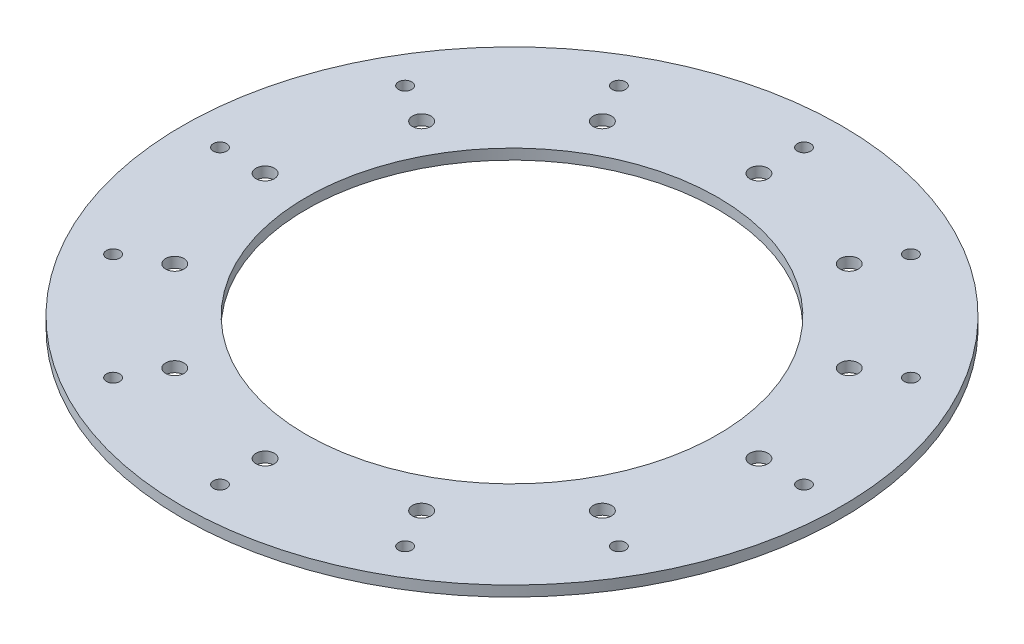
ISO-10303-21;
HEADER;
FILE_DESCRIPTION(('STEP AP214'),'2;1');
FILE_NAME('part.step','',(''),(''),'','','');
FILE_SCHEMA(('AUTOMOTIVE_DESIGN { 1 0 10303 214 1 1 1 1 }'));
ENDSEC;
DATA;
#1=APPLICATION_CONTEXT('core data for automotive mechanical design processes');
#2=APPLICATION_PROTOCOL_DEFINITION('international standard','automotive_design',2000,#1);
#3=PRODUCT_CONTEXT('',#1,'mechanical');
#4=PRODUCT('Part','Part','',(#3));
#5=PRODUCT_RELATED_PRODUCT_CATEGORY('part','',(#4));
#6=PRODUCT_DEFINITION_FORMATION('','',#4);
#7=PRODUCT_DEFINITION_CONTEXT('part definition',#1,'design');
#8=PRODUCT_DEFINITION('design','',#6,#7);
#9=PRODUCT_DEFINITION_SHAPE('','',#8);
#10=(LENGTH_UNIT() NAMED_UNIT(*) SI_UNIT(.MILLI.,.METRE.));
#11=(NAMED_UNIT(*) PLANE_ANGLE_UNIT() SI_UNIT($,.RADIAN.));
#12=(NAMED_UNIT(*) SI_UNIT($,.STERADIAN.) SOLID_ANGLE_UNIT());
#13=UNCERTAINTY_MEASURE_WITH_UNIT(LENGTH_MEASURE(1.E-05),#10,'distance_accuracy_value','');
#14=(GEOMETRIC_REPRESENTATION_CONTEXT(3) GLOBAL_UNCERTAINTY_ASSIGNED_CONTEXT((#13)) GLOBAL_UNIT_ASSIGNED_CONTEXT((#10,
#11,#12)) REPRESENTATION_CONTEXT('',''));
#15=CARTESIAN_POINT('',(0.,0.,0.));
#16=DIRECTION('',(0.,0.,1.));
#17=DIRECTION('',(1.,0.,0.));
#18=AXIS2_PLACEMENT_3D('',#15,#16,#17);
#19=CARTESIAN_POINT('',(0.,2.5,0.));
#20=DIRECTION('',(0.,1.,0.));
#21=DIRECTION('',(0.,0.,1.));
#22=AXIS2_PLACEMENT_3D('',#19,#20,#21);
#23=PLANE('',#22);
#24=CARTESIAN_POINT('',(29.5899999999978,2.5,-51.2513833959643));
#25=DIRECTION('',(0.,1.,0.));
#26=DIRECTION('',(0.,0.,1.));
#27=AXIS2_PLACEMENT_3D('',#24,#25,#26);
#28=CIRCLE('',#27,2.19999999999999);
#29=CARTESIAN_POINT('',(29.5899999999978,2.5,-49.0513833959643));
#30=VERTEX_POINT('',#29);
#31=EDGE_CURVE('E189',#30,#30,#28,.T.);
#32=ORIENTED_EDGE('',*,*,#31,.F.);
#33=EDGE_LOOP('',(#32));
#34=FACE_BOUND('',#33,.T.);
#35=CARTESIAN_POINT('',(51.2513833959618,2.5,-29.5900000000022));
#36=DIRECTION('',(0.,1.,0.));
#37=DIRECTION('',(0.,0.,1.));
#38=AXIS2_PLACEMENT_3D('',#35,#36,#37);
#39=CIRCLE('',#38,2.20000000000001);
#40=CARTESIAN_POINT('',(51.2513833959618,2.5,-27.3900000000022));
#41=VERTEX_POINT('',#40);
#42=EDGE_CURVE('E183',#41,#41,#39,.T.);
#43=ORIENTED_EDGE('',*,*,#42,.F.);
#44=EDGE_LOOP('',(#43));
#45=FACE_BOUND('',#44,.T.);
#46=CARTESIAN_POINT('',(59.18,2.5,-2.51925216798732E-12));
#47=DIRECTION('',(0.,1.,0.));
#48=DIRECTION('',(0.,0.,1.));
#49=AXIS2_PLACEMENT_3D('',#46,#47,#48);
#50=CIRCLE('',#49,2.2);
#51=CARTESIAN_POINT('',(59.18,2.5,2.19999999999748));
#52=VERTEX_POINT('',#51);
#53=EDGE_CURVE('E177',#52,#52,#50,.T.);
#54=ORIENTED_EDGE('',*,*,#53,.F.);
#55=EDGE_LOOP('',(#54));
#56=FACE_BOUND('',#55,.T.);
#57=CARTESIAN_POINT('',(51.2513833959643,2.5,29.5899999999978));
#58=DIRECTION('',(0.,1.,0.));
#59=DIRECTION('',(0.,0.,1.));
#60=AXIS2_PLACEMENT_3D('',#57,#58,#59);
#61=CIRCLE('',#60,2.2);
#62=CARTESIAN_POINT('',(51.2513833959643,2.5,31.7899999999978));
#63=VERTEX_POINT('',#62);
#64=EDGE_CURVE('E171',#63,#63,#61,.T.);
#65=ORIENTED_EDGE('',*,*,#64,.F.);
#66=EDGE_LOOP('',(#65));
#67=FACE_BOUND('',#66,.T.);
#68=CARTESIAN_POINT('',(29.5900000000022,2.5,51.2513833959618));
#69=DIRECTION('',(0.,1.,0.));
#70=DIRECTION('',(0.,0.,1.));
#71=AXIS2_PLACEMENT_3D('',#68,#69,#70);
#72=CIRCLE('',#71,2.2);
#73=CARTESIAN_POINT('',(29.5900000000022,2.5,53.4513833959618));
#74=VERTEX_POINT('',#73);
#75=EDGE_CURVE('E165',#74,#74,#72,.T.);
#76=ORIENTED_EDGE('',*,*,#75,.F.);
#77=EDGE_LOOP('',(#76));
#78=FACE_BOUND('',#77,.T.);
#79=CARTESIAN_POINT('',(2.5157214821059E-12,2.5,59.18));
#80=DIRECTION('',(0.,1.,0.));
#81=DIRECTION('',(0.,0.,1.));
#82=AXIS2_PLACEMENT_3D('',#79,#80,#81);
#83=CIRCLE('',#82,2.2);
#84=CARTESIAN_POINT('',(2.5157214821059E-12,2.5,61.38));
#85=VERTEX_POINT('',#84);
#86=EDGE_CURVE('E159',#85,#85,#83,.T.);
#87=ORIENTED_EDGE('',*,*,#86,.F.);
#88=EDGE_LOOP('',(#87));
#89=FACE_BOUND('',#88,.T.);
#90=CARTESIAN_POINT('',(-29.5899999999978,2.5,51.2513833959643));
#91=DIRECTION('',(0.,1.,0.));
#92=DIRECTION('',(0.,0.,1.));
#93=AXIS2_PLACEMENT_3D('',#90,#91,#92);
#94=CIRCLE('',#93,2.2);
#95=CARTESIAN_POINT('',(-29.5899999999978,2.5,53.4513833959643));
#96=VERTEX_POINT('',#95);
#97=EDGE_CURVE('E153',#96,#96,#94,.T.);
#98=ORIENTED_EDGE('',*,*,#97,.F.);
#99=EDGE_LOOP('',(#98));
#100=FACE_BOUND('',#99,.T.);
#101=CARTESIAN_POINT('',(-51.2513833959618,2.5,29.5900000000022));
#102=DIRECTION('',(0.,1.,0.));
#103=DIRECTION('',(0.,0.,1.));
#104=AXIS2_PLACEMENT_3D('',#101,#102,#103);
#105=CIRCLE('',#104,2.2);
#106=CARTESIAN_POINT('',(-51.2513833959618,2.5,31.7900000000022));
#107=VERTEX_POINT('',#106);
#108=EDGE_CURVE('E147',#107,#107,#105,.T.);
#109=ORIENTED_EDGE('',*,*,#108,.F.);
#110=EDGE_LOOP('',(#109));
#111=FACE_BOUND('',#110,.T.);
#112=CARTESIAN_POINT('',(-59.18,2.5,2.52662474276022E-12));
#113=DIRECTION('',(0.,1.,0.));
#114=DIRECTION('',(0.,0.,1.));
#115=AXIS2_PLACEMENT_3D('',#112,#113,#114);
#116=CIRCLE('',#115,2.2);
#117=CARTESIAN_POINT('',(-59.18,2.5,2.20000000000253));
#118=VERTEX_POINT('',#117);
#119=EDGE_CURVE('E141',#118,#118,#116,.T.);
#120=ORIENTED_EDGE('',*,*,#119,.F.);
#121=EDGE_LOOP('',(#120));
#122=FACE_BOUND('',#121,.T.);
#123=CARTESIAN_POINT('',(-51.2513833959643,2.5,-29.5899999999978));
#124=DIRECTION('',(0.,1.,0.));
#125=DIRECTION('',(0.,0.,1.));
#126=AXIS2_PLACEMENT_3D('',#123,#124,#125);
#127=CIRCLE('',#126,2.2);
#128=CARTESIAN_POINT('',(-51.2513833959643,2.5,-27.3899999999978));
#129=VERTEX_POINT('',#128);
#130=EDGE_CURVE('E135',#129,#129,#127,.T.);
#131=ORIENTED_EDGE('',*,*,#130,.F.);
#132=EDGE_LOOP('',(#131));
#133=FACE_BOUND('',#132,.T.);
#134=CARTESIAN_POINT('',(-29.5900000000022,2.5,-51.2513833959618));
#135=DIRECTION('',(0.,1.,0.));
#136=DIRECTION('',(0.,0.,1.));
#137=AXIS2_PLACEMENT_3D('',#134,#135,#136);
#138=CIRCLE('',#137,2.2);
#139=CARTESIAN_POINT('',(-29.5900000000022,2.5,-49.0513833959618));
#140=VERTEX_POINT('',#139);
#141=EDGE_CURVE('E129',#140,#140,#138,.T.);
#142=ORIENTED_EDGE('',*,*,#141,.F.);
#143=EDGE_LOOP('',(#142));
#144=FACE_BOUND('',#143,.T.);
#145=CARTESIAN_POINT('',(-2.51573553974758E-12,2.5,-59.18));
#146=DIRECTION('',(0.,1.,0.));
#147=DIRECTION('',(0.,0.,1.));
#148=AXIS2_PLACEMENT_3D('',#145,#146,#147);
#149=CIRCLE('',#148,2.2);
#150=CARTESIAN_POINT('',(-2.51573553974758E-12,2.5,-56.98));
#151=VERTEX_POINT('',#150);
#152=EDGE_CURVE('E123',#151,#151,#149,.T.);
#153=ORIENTED_EDGE('',*,*,#152,.F.);
#154=EDGE_LOOP('',(#153));
#155=FACE_BOUND('',#154,.T.);
#156=CARTESIAN_POINT('',(35.0000000000011,2.5,-60.6217782649147));
#157=DIRECTION('',(0.,1.,0.));
#158=DIRECTION('',(0.,0.,1.));
#159=AXIS2_PLACEMENT_3D('',#156,#157,#158);
#160=CIRCLE('',#159,1.59999999999992);
#161=CARTESIAN_POINT('',(35.0000000000011,2.5,-59.0217782649148));
#162=VERTEX_POINT('',#161);
#163=EDGE_CURVE('E118',#162,#162,#160,.T.);
#164=ORIENTED_EDGE('',*,*,#163,.F.);
#165=EDGE_LOOP('',(#164));
#166=FACE_BOUND('',#165,.T.);
#167=CARTESIAN_POINT('',(60.6217782649147,2.5,-35.0000000000069));
#168=DIRECTION('',(0.,1.,0.));
#169=DIRECTION('',(0.,0.,1.));
#170=AXIS2_PLACEMENT_3D('',#167,#168,#169);
#171=CIRCLE('',#170,1.60000000000196);
#172=CARTESIAN_POINT('',(60.6217782649147,2.5,-33.4000000000049));
#173=VERTEX_POINT('',#172);
#174=EDGE_CURVE('E112',#173,#173,#171,.T.);
#175=ORIENTED_EDGE('',*,*,#174,.F.);
#176=EDGE_LOOP('',(#175));
#177=FACE_BOUND('',#176,.T.);
#178=CARTESIAN_POINT('',(70.000000000008,2.5,-7.94950611291909E-12));
#179=DIRECTION('',(0.,1.,0.));
#180=DIRECTION('',(0.,0.,1.));
#181=AXIS2_PLACEMENT_3D('',#178,#179,#180);
#182=CIRCLE('',#181,1.60000000000551);
#183=CARTESIAN_POINT('',(70.000000000008,2.5,1.59999999999756));
#184=VERTEX_POINT('',#183);
#185=EDGE_CURVE('E106',#184,#184,#182,.T.);
#186=ORIENTED_EDGE('',*,*,#185,.F.);
#187=EDGE_LOOP('',(#186));
#188=FACE_BOUND('',#187,.T.);
#189=CARTESIAN_POINT('',(60.6217782649226,2.5,34.9999999999931));
#190=DIRECTION('',(0.,1.,0.));
#191=DIRECTION('',(0.,0.,1.));
#192=AXIS2_PLACEMENT_3D('',#189,#190,#191);
#193=CIRCLE('',#192,1.60000000000973);
#194=CARTESIAN_POINT('',(60.6217782649226,2.5,36.6000000000028));
#195=VERTEX_POINT('',#194);
#196=EDGE_CURVE('E100',#195,#195,#193,.T.);
#197=ORIENTED_EDGE('',*,*,#196,.F.);
#198=EDGE_LOOP('',(#197));
#199=FACE_BOUND('',#198,.T.);
#200=CARTESIAN_POINT('',(35.0000000000149,2.5,60.6217782649067));
#201=DIRECTION('',(0.,1.,0.));
#202=DIRECTION('',(0.,0.,1.));
#203=AXIS2_PLACEMENT_3D('',#200,#201,#202);
#204=CIRCLE('',#203,1.60000000001344);
#205=CARTESIAN_POINT('',(35.0000000000149,2.5,62.2217782649202));
#206=VERTEX_POINT('',#205);
#207=EDGE_CURVE('E94',#206,#206,#204,.T.);
#208=ORIENTED_EDGE('',*,*,#207,.F.);
#209=EDGE_LOOP('',(#208));
#210=FACE_BOUND('',#209,.T.);
#211=CARTESIAN_POINT('',(1.58990122258382E-11,2.5,70.));
#212=DIRECTION('',(0.,1.,0.));
#213=DIRECTION('',(0.,0.,1.));
#214=AXIS2_PLACEMENT_3D('',#211,#212,#213);
#215=CIRCLE('',#214,1.60000000001567);
#216=CARTESIAN_POINT('',(1.58990122258382E-11,2.5,71.6000000000157));
#217=VERTEX_POINT('',#216);
#218=EDGE_CURVE('E88',#217,#217,#215,.T.);
#219=ORIENTED_EDGE('',*,*,#218,.F.);
#220=EDGE_LOOP('',(#219));
#221=FACE_BOUND('',#220,.T.);
#222=CARTESIAN_POINT('',(-34.9999999999852,2.5,60.6217782649147));
#223=DIRECTION('',(0.,1.,0.));
#224=DIRECTION('',(0.,0.,1.));
#225=AXIS2_PLACEMENT_3D('',#222,#223,#224);
#226=CIRCLE('',#225,1.6000000000159);
#227=CARTESIAN_POINT('',(-34.9999999999852,2.5,62.2217782649306));
#228=VERTEX_POINT('',#227);
#229=EDGE_CURVE('E82',#228,#228,#226,.T.);
#230=ORIENTED_EDGE('',*,*,#229,.F.);
#231=EDGE_LOOP('',(#230));
#232=FACE_BOUND('',#231,.T.);
#233=CARTESIAN_POINT('',(-60.6217782648988,2.5,35.0000000000069));
#234=DIRECTION('',(0.,1.,0.));
#235=DIRECTION('',(0.,0.,1.));
#236=AXIS2_PLACEMENT_3D('',#233,#234,#235);
#237=CIRCLE('',#236,1.60000000001406);
#238=CARTESIAN_POINT('',(-60.6217782648988,2.5,36.600000000021));
#239=VERTEX_POINT('',#238);
#240=EDGE_CURVE('E76',#239,#239,#237,.T.);
#241=ORIENTED_EDGE('',*,*,#240,.F.);
#242=EDGE_LOOP('',(#241));
#243=FACE_BOUND('',#242,.T.);
#244=CARTESIAN_POINT('',(-69.9999999999921,2.5,7.95807864051312E-12));
#245=DIRECTION('',(0.,1.,0.));
#246=DIRECTION('',(0.,0.,1.));
#247=AXIS2_PLACEMENT_3D('',#244,#245,#246);
#248=CIRCLE('',#247,1.60000000001064);
#249=CARTESIAN_POINT('',(-69.9999999999921,2.5,1.6000000000186));
#250=VERTEX_POINT('',#249);
#251=EDGE_CURVE('E70',#250,#250,#248,.T.);
#252=ORIENTED_EDGE('',*,*,#251,.F.);
#253=EDGE_LOOP('',(#252));
#254=FACE_BOUND('',#253,.T.);
#255=CARTESIAN_POINT('',(-60.6217782649068,2.5,-34.9999999999931));
#256=DIRECTION('',(0.,1.,0.));
#257=DIRECTION('',(0.,0.,1.));
#258=AXIS2_PLACEMENT_3D('',#255,#256,#257);
#259=CIRCLE('',#258,1.60000000000665);
#260=CARTESIAN_POINT('',(-60.6217782649068,2.5,-33.3999999999864));
#261=VERTEX_POINT('',#260);
#262=EDGE_CURVE('E64',#261,#261,#259,.T.);
#263=ORIENTED_EDGE('',*,*,#262,.F.);
#264=EDGE_LOOP('',(#263));
#265=FACE_BOUND('',#264,.T.);
#266=CARTESIAN_POINT('',(-34.999999999999,2.5,-60.6217782649067));
#267=DIRECTION('',(0.,1.,0.));
#268=DIRECTION('',(0.,0.,1.));
#269=AXIS2_PLACEMENT_3D('',#266,#267,#268);
#270=CIRCLE('',#269,1.60000000000308);
#271=CARTESIAN_POINT('',(-34.999999999999,2.5,-59.0217782649036));
#272=VERTEX_POINT('',#271);
#273=EDGE_CURVE('E57',#272,#272,#270,.T.);
#274=ORIENTED_EDGE('',*,*,#273,.F.);
#275=EDGE_LOOP('',(#274));
#276=FACE_BOUND('',#275,.T.);
#277=CARTESIAN_POINT('',(0.,2.5,-70.));
#278=DIRECTION('',(0.,1.,0.));
#279=DIRECTION('',(0.,0.,1.));
#280=AXIS2_PLACEMENT_3D('',#277,#278,#279);
#281=CIRCLE('',#280,1.6);
#282=CARTESIAN_POINT('',(0.,2.5,-68.4));
#283=VERTEX_POINT('',#282);
#284=EDGE_CURVE('E51',#283,#283,#281,.T.);
#285=ORIENTED_EDGE('',*,*,#284,.F.);
#286=EDGE_LOOP('',(#285));
#287=FACE_BOUND('',#286,.T.);
#288=CARTESIAN_POINT('',(0.,2.5,0.));
#289=DIRECTION('',(0.,1.,0.));
#290=DIRECTION('',(0.,0.,1.));
#291=AXIS2_PLACEMENT_3D('',#288,#289,#290);
#292=CIRCLE('',#291,79.);
#293=CARTESIAN_POINT('',(0.,2.5,79.));
#294=VERTEX_POINT('',#293);
#295=EDGE_CURVE('E10',#294,#294,#292,.T.);
#296=ORIENTED_EDGE('',*,*,#295,.T.);
#297=EDGE_LOOP('',(#296));
#298=FACE_BOUND('',#297,.T.);
#299=CARTESIAN_POINT('',(0.,2.5,0.));
#300=DIRECTION('',(0.,1.,0.));
#301=DIRECTION('',(0.,0.,1.));
#302=AXIS2_PLACEMENT_3D('',#299,#300,#301);
#303=CIRCLE('',#302,49.3);
#304=CARTESIAN_POINT('',(0.,2.5,49.3));
#305=VERTEX_POINT('',#304);
#306=EDGE_CURVE('E43',#305,#305,#303,.T.);
#307=ORIENTED_EDGE('',*,*,#306,.F.);
#308=EDGE_LOOP('',(#307));
#309=FACE_BOUND('',#308,.T.);
#310=ADVANCED_FACE('F32',(#34,#45,#56,#67,#78,#89,#100,#111,#122,#133,#144,#155,#166,#177,#188,
#199,#210,#221,#232,#243,#254,#265,#276,#287,#298,#309),#23,.T.);
#311=CARTESIAN_POINT('',(0.,0.,0.));
#312=DIRECTION('',(0.,1.,0.));
#313=DIRECTION('',(0.,0.,1.));
#314=AXIS2_PLACEMENT_3D('',#311,#312,#313);
#315=PLANE('',#314);
#316=CARTESIAN_POINT('',(29.5899999999978,0.,-51.2513833959643));
#317=DIRECTION('',(0.,1.,0.));
#318=DIRECTION('',(0.,0.,1.));
#319=AXIS2_PLACEMENT_3D('',#316,#317,#318);
#320=CIRCLE('',#319,2.19999999999999);
#321=CARTESIAN_POINT('',(29.5899999999978,0.,-49.0513833959643));
#322=VERTEX_POINT('',#321);
#323=EDGE_CURVE('E126',#322,#322,#320,.T.);
#324=ORIENTED_EDGE('',*,*,#323,.T.);
#325=EDGE_LOOP('',(#324));
#326=FACE_BOUND('',#325,.T.);
#327=CARTESIAN_POINT('',(51.2513833959618,0.,-29.5900000000022));
#328=DIRECTION('',(0.,1.,0.));
#329=DIRECTION('',(0.,0.,1.));
#330=AXIS2_PLACEMENT_3D('',#327,#328,#329);
#331=CIRCLE('',#330,2.20000000000001);
#332=CARTESIAN_POINT('',(51.2513833959618,0.,-27.3900000000022));
#333=VERTEX_POINT('',#332);
#334=EDGE_CURVE('E186',#333,#333,#331,.T.);
#335=ORIENTED_EDGE('',*,*,#334,.T.);
#336=EDGE_LOOP('',(#335));
#337=FACE_BOUND('',#336,.T.);
#338=CARTESIAN_POINT('',(59.18,0.,-2.51925216798732E-12));
#339=DIRECTION('',(0.,1.,0.));
#340=DIRECTION('',(0.,0.,1.));
#341=AXIS2_PLACEMENT_3D('',#338,#339,#340);
#342=CIRCLE('',#341,2.2);
#343=CARTESIAN_POINT('',(59.18,0.,2.19999999999748));
#344=VERTEX_POINT('',#343);
#345=EDGE_CURVE('E180',#344,#344,#342,.T.);
#346=ORIENTED_EDGE('',*,*,#345,.T.);
#347=EDGE_LOOP('',(#346));
#348=FACE_BOUND('',#347,.T.);
#349=CARTESIAN_POINT('',(51.2513833959643,0.,29.5899999999978));
#350=DIRECTION('',(0.,1.,0.));
#351=DIRECTION('',(0.,0.,1.));
#352=AXIS2_PLACEMENT_3D('',#349,#350,#351);
#353=CIRCLE('',#352,2.2);
#354=CARTESIAN_POINT('',(51.2513833959643,0.,31.7899999999978));
#355=VERTEX_POINT('',#354);
#356=EDGE_CURVE('E174',#355,#355,#353,.T.);
#357=ORIENTED_EDGE('',*,*,#356,.T.);
#358=EDGE_LOOP('',(#357));
#359=FACE_BOUND('',#358,.T.);
#360=CARTESIAN_POINT('',(29.5900000000022,0.,51.2513833959618));
#361=DIRECTION('',(0.,1.,0.));
#362=DIRECTION('',(0.,0.,1.));
#363=AXIS2_PLACEMENT_3D('',#360,#361,#362);
#364=CIRCLE('',#363,2.2);
#365=CARTESIAN_POINT('',(29.5900000000022,0.,53.4513833959618));
#366=VERTEX_POINT('',#365);
#367=EDGE_CURVE('E168',#366,#366,#364,.T.);
#368=ORIENTED_EDGE('',*,*,#367,.T.);
#369=EDGE_LOOP('',(#368));
#370=FACE_BOUND('',#369,.T.);
#371=CARTESIAN_POINT('',(2.5157214821059E-12,0.,59.18));
#372=DIRECTION('',(0.,1.,0.));
#373=DIRECTION('',(0.,0.,1.));
#374=AXIS2_PLACEMENT_3D('',#371,#372,#373);
#375=CIRCLE('',#374,2.2);
#376=CARTESIAN_POINT('',(2.5157214821059E-12,0.,61.38));
#377=VERTEX_POINT('',#376);
#378=EDGE_CURVE('E162',#377,#377,#375,.T.);
#379=ORIENTED_EDGE('',*,*,#378,.T.);
#380=EDGE_LOOP('',(#379));
#381=FACE_BOUND('',#380,.T.);
#382=CARTESIAN_POINT('',(-29.5899999999978,0.,51.2513833959643));
#383=DIRECTION('',(0.,1.,0.));
#384=DIRECTION('',(0.,0.,1.));
#385=AXIS2_PLACEMENT_3D('',#382,#383,#384);
#386=CIRCLE('',#385,2.2);
#387=CARTESIAN_POINT('',(-29.5899999999978,0.,53.4513833959643));
#388=VERTEX_POINT('',#387);
#389=EDGE_CURVE('E156',#388,#388,#386,.T.);
#390=ORIENTED_EDGE('',*,*,#389,.T.);
#391=EDGE_LOOP('',(#390));
#392=FACE_BOUND('',#391,.T.);
#393=CARTESIAN_POINT('',(-51.2513833959618,0.,29.5900000000022));
#394=DIRECTION('',(0.,1.,0.));
#395=DIRECTION('',(0.,0.,1.));
#396=AXIS2_PLACEMENT_3D('',#393,#394,#395);
#397=CIRCLE('',#396,2.2);
#398=CARTESIAN_POINT('',(-51.2513833959618,0.,31.7900000000022));
#399=VERTEX_POINT('',#398);
#400=EDGE_CURVE('E150',#399,#399,#397,.T.);
#401=ORIENTED_EDGE('',*,*,#400,.T.);
#402=EDGE_LOOP('',(#401));
#403=FACE_BOUND('',#402,.T.);
#404=CARTESIAN_POINT('',(-59.18,0.,2.52662474276022E-12));
#405=DIRECTION('',(0.,1.,0.));
#406=DIRECTION('',(0.,0.,1.));
#407=AXIS2_PLACEMENT_3D('',#404,#405,#406);
#408=CIRCLE('',#407,2.2);
#409=CARTESIAN_POINT('',(-59.18,0.,2.20000000000253));
#410=VERTEX_POINT('',#409);
#411=EDGE_CURVE('E144',#410,#410,#408,.T.);
#412=ORIENTED_EDGE('',*,*,#411,.T.);
#413=EDGE_LOOP('',(#412));
#414=FACE_BOUND('',#413,.T.);
#415=CARTESIAN_POINT('',(-51.2513833959643,0.,-29.5899999999978));
#416=DIRECTION('',(0.,1.,0.));
#417=DIRECTION('',(0.,0.,1.));
#418=AXIS2_PLACEMENT_3D('',#415,#416,#417);
#419=CIRCLE('',#418,2.2);
#420=CARTESIAN_POINT('',(-51.2513833959643,0.,-27.3899999999978));
#421=VERTEX_POINT('',#420);
#422=EDGE_CURVE('E138',#421,#421,#419,.T.);
#423=ORIENTED_EDGE('',*,*,#422,.T.);
#424=EDGE_LOOP('',(#423));
#425=FACE_BOUND('',#424,.T.);
#426=CARTESIAN_POINT('',(-29.5900000000022,0.,-51.2513833959618));
#427=DIRECTION('',(0.,1.,0.));
#428=DIRECTION('',(0.,0.,1.));
#429=AXIS2_PLACEMENT_3D('',#426,#427,#428);
#430=CIRCLE('',#429,2.2);
#431=CARTESIAN_POINT('',(-29.5900000000022,0.,-49.0513833959618));
#432=VERTEX_POINT('',#431);
#433=EDGE_CURVE('E132',#432,#432,#430,.T.);
#434=ORIENTED_EDGE('',*,*,#433,.T.);
#435=EDGE_LOOP('',(#434));
#436=FACE_BOUND('',#435,.T.);
#437=CARTESIAN_POINT('',(-2.51573553974758E-12,0.,-59.18));
#438=DIRECTION('',(0.,1.,0.));
#439=DIRECTION('',(0.,0.,1.));
#440=AXIS2_PLACEMENT_3D('',#437,#438,#439);
#441=CIRCLE('',#440,2.2);
#442=CARTESIAN_POINT('',(-2.51573553974758E-12,0.,-56.98));
#443=VERTEX_POINT('',#442);
#444=EDGE_CURVE('E61',#443,#443,#441,.T.);
#445=ORIENTED_EDGE('',*,*,#444,.T.);
#446=EDGE_LOOP('',(#445));
#447=FACE_BOUND('',#446,.T.);
#448=CARTESIAN_POINT('',(35.0000000000011,0.,-60.6217782649147));
#449=DIRECTION('',(0.,1.,0.));
#450=DIRECTION('',(0.,0.,1.));
#451=AXIS2_PLACEMENT_3D('',#448,#449,#450);
#452=CIRCLE('',#451,1.59999999999992);
#453=CARTESIAN_POINT('',(35.0000000000011,0.,-59.0217782649148));
#454=VERTEX_POINT('',#453);
#455=EDGE_CURVE('E54',#454,#454,#452,.T.);
#456=ORIENTED_EDGE('',*,*,#455,.T.);
#457=EDGE_LOOP('',(#456));
#458=FACE_BOUND('',#457,.T.);
#459=CARTESIAN_POINT('',(60.6217782649147,0.,-35.0000000000069));
#460=DIRECTION('',(0.,1.,0.));
#461=DIRECTION('',(0.,0.,1.));
#462=AXIS2_PLACEMENT_3D('',#459,#460,#461);
#463=CIRCLE('',#462,1.60000000000196);
#464=CARTESIAN_POINT('',(60.6217782649147,0.,-33.4000000000049));
#465=VERTEX_POINT('',#464);
#466=EDGE_CURVE('E115',#465,#465,#463,.T.);
#467=ORIENTED_EDGE('',*,*,#466,.T.);
#468=EDGE_LOOP('',(#467));
#469=FACE_BOUND('',#468,.T.);
#470=CARTESIAN_POINT('',(70.000000000008,0.,-7.94950611291909E-12));
#471=DIRECTION('',(0.,1.,0.));
#472=DIRECTION('',(0.,0.,1.));
#473=AXIS2_PLACEMENT_3D('',#470,#471,#472);
#474=CIRCLE('',#473,1.60000000000551);
#475=CARTESIAN_POINT('',(70.000000000008,0.,1.59999999999756));
#476=VERTEX_POINT('',#475);
#477=EDGE_CURVE('E109',#476,#476,#474,.T.);
#478=ORIENTED_EDGE('',*,*,#477,.T.);
#479=EDGE_LOOP('',(#478));
#480=FACE_BOUND('',#479,.T.);
#481=CARTESIAN_POINT('',(60.6217782649226,0.,34.9999999999931));
#482=DIRECTION('',(0.,1.,0.));
#483=DIRECTION('',(0.,0.,1.));
#484=AXIS2_PLACEMENT_3D('',#481,#482,#483);
#485=CIRCLE('',#484,1.60000000000973);
#486=CARTESIAN_POINT('',(60.6217782649226,0.,36.6000000000028));
#487=VERTEX_POINT('',#486);
#488=EDGE_CURVE('E103',#487,#487,#485,.T.);
#489=ORIENTED_EDGE('',*,*,#488,.T.);
#490=EDGE_LOOP('',(#489));
#491=FACE_BOUND('',#490,.T.);
#492=CARTESIAN_POINT('',(35.0000000000149,0.,60.6217782649067));
#493=DIRECTION('',(0.,1.,0.));
#494=DIRECTION('',(0.,0.,1.));
#495=AXIS2_PLACEMENT_3D('',#492,#493,#494);
#496=CIRCLE('',#495,1.60000000001344);
#497=CARTESIAN_POINT('',(35.0000000000149,0.,62.2217782649202));
#498=VERTEX_POINT('',#497);
#499=EDGE_CURVE('E97',#498,#498,#496,.T.);
#500=ORIENTED_EDGE('',*,*,#499,.T.);
#501=EDGE_LOOP('',(#500));
#502=FACE_BOUND('',#501,.T.);
#503=CARTESIAN_POINT('',(1.58990122258382E-11,0.,70.));
#504=DIRECTION('',(0.,1.,0.));
#505=DIRECTION('',(0.,0.,1.));
#506=AXIS2_PLACEMENT_3D('',#503,#504,#505);
#507=CIRCLE('',#506,1.60000000001567);
#508=CARTESIAN_POINT('',(1.58990122258382E-11,0.,71.6000000000157));
#509=VERTEX_POINT('',#508);
#510=EDGE_CURVE('E91',#509,#509,#507,.T.);
#511=ORIENTED_EDGE('',*,*,#510,.T.);
#512=EDGE_LOOP('',(#511));
#513=FACE_BOUND('',#512,.T.);
#514=CARTESIAN_POINT('',(-34.9999999999852,0.,60.6217782649147));
#515=DIRECTION('',(0.,1.,0.));
#516=DIRECTION('',(0.,0.,1.));
#517=AXIS2_PLACEMENT_3D('',#514,#515,#516);
#518=CIRCLE('',#517,1.6000000000159);
#519=CARTESIAN_POINT('',(-34.9999999999852,0.,62.2217782649306));
#520=VERTEX_POINT('',#519);
#521=EDGE_CURVE('E85',#520,#520,#518,.T.);
#522=ORIENTED_EDGE('',*,*,#521,.T.);
#523=EDGE_LOOP('',(#522));
#524=FACE_BOUND('',#523,.T.);
#525=CARTESIAN_POINT('',(-60.6217782648988,0.,35.0000000000069));
#526=DIRECTION('',(0.,1.,0.));
#527=DIRECTION('',(0.,0.,1.));
#528=AXIS2_PLACEMENT_3D('',#525,#526,#527);
#529=CIRCLE('',#528,1.60000000001406);
#530=CARTESIAN_POINT('',(-60.6217782648988,0.,36.600000000021));
#531=VERTEX_POINT('',#530);
#532=EDGE_CURVE('E79',#531,#531,#529,.T.);
#533=ORIENTED_EDGE('',*,*,#532,.T.);
#534=EDGE_LOOP('',(#533));
#535=FACE_BOUND('',#534,.T.);
#536=CARTESIAN_POINT('',(-69.9999999999921,0.,7.95807864051312E-12));
#537=DIRECTION('',(0.,1.,0.));
#538=DIRECTION('',(0.,0.,1.));
#539=AXIS2_PLACEMENT_3D('',#536,#537,#538);
#540=CIRCLE('',#539,1.60000000001064);
#541=CARTESIAN_POINT('',(-69.9999999999921,0.,1.6000000000186));
#542=VERTEX_POINT('',#541);
#543=EDGE_CURVE('E73',#542,#542,#540,.T.);
#544=ORIENTED_EDGE('',*,*,#543,.T.);
#545=EDGE_LOOP('',(#544));
#546=FACE_BOUND('',#545,.T.);
#547=CARTESIAN_POINT('',(-60.6217782649068,0.,-34.9999999999931));
#548=DIRECTION('',(0.,1.,0.));
#549=DIRECTION('',(0.,0.,1.));
#550=AXIS2_PLACEMENT_3D('',#547,#548,#549);
#551=CIRCLE('',#550,1.60000000000665);
#552=CARTESIAN_POINT('',(-60.6217782649068,0.,-33.3999999999864));
#553=VERTEX_POINT('',#552);
#554=EDGE_CURVE('E67',#553,#553,#551,.T.);
#555=ORIENTED_EDGE('',*,*,#554,.T.);
#556=EDGE_LOOP('',(#555));
#557=FACE_BOUND('',#556,.T.);
#558=CARTESIAN_POINT('',(-34.999999999999,0.,-60.6217782649067));
#559=DIRECTION('',(0.,1.,0.));
#560=DIRECTION('',(0.,0.,1.));
#561=AXIS2_PLACEMENT_3D('',#558,#559,#560);
#562=CIRCLE('',#561,1.60000000000308);
#563=CARTESIAN_POINT('',(-34.999999999999,0.,-59.0217782649036));
#564=VERTEX_POINT('',#563);
#565=EDGE_CURVE('E60',#564,#564,#562,.T.);
#566=ORIENTED_EDGE('',*,*,#565,.T.);
#567=EDGE_LOOP('',(#566));
#568=FACE_BOUND('',#567,.T.);
#569=CARTESIAN_POINT('',(0.,0.,-70.));
#570=DIRECTION('',(0.,1.,0.));
#571=DIRECTION('',(0.,0.,1.));
#572=AXIS2_PLACEMENT_3D('',#569,#570,#571);
#573=CIRCLE('',#572,1.6);
#574=CARTESIAN_POINT('',(0.,0.,-68.4));
#575=VERTEX_POINT('',#574);
#576=EDGE_CURVE('E48',#575,#575,#573,.T.);
#577=ORIENTED_EDGE('',*,*,#576,.T.);
#578=EDGE_LOOP('',(#577));
#579=FACE_BOUND('',#578,.T.);
#580=CARTESIAN_POINT('',(0.,0.,0.));
#581=DIRECTION('',(0.,1.,0.));
#582=DIRECTION('',(0.,0.,1.));
#583=AXIS2_PLACEMENT_3D('',#580,#581,#582);
#584=CIRCLE('',#583,79.);
#585=CARTESIAN_POINT('',(0.,0.,79.));
#586=VERTEX_POINT('',#585);
#587=EDGE_CURVE('E36',#586,#586,#584,.T.);
#588=ORIENTED_EDGE('',*,*,#587,.F.);
#589=EDGE_LOOP('',(#588));
#590=FACE_BOUND('',#589,.T.);
#591=CARTESIAN_POINT('',(0.,0.,0.));
#592=DIRECTION('',(0.,1.,0.));
#593=DIRECTION('',(0.,0.,1.));
#594=AXIS2_PLACEMENT_3D('',#591,#592,#593);
#595=CIRCLE('',#594,49.3);
#596=CARTESIAN_POINT('',(0.,0.,49.3));
#597=VERTEX_POINT('',#596);
#598=EDGE_CURVE('E45',#597,#597,#595,.T.);
#599=ORIENTED_EDGE('',*,*,#598,.T.);
#600=EDGE_LOOP('',(#599));
#601=FACE_BOUND('',#600,.T.);
#602=ADVANCED_FACE('F195',(#326,#337,#348,#359,#370,#381,#392,#403,#414,#425,#436,#447,#458,
#469,#480,#491,#502,#513,#524,#535,#546,#557,#568,#579,#590,#601),#315,.F.);
#603=CARTESIAN_POINT('',(0.,2.5,0.));
#604=DIRECTION('',(0.,-1.,0.));
#605=DIRECTION('',(0.,0.,-1.));
#606=AXIS2_PLACEMENT_3D('',#603,#604,#605);
#607=CYLINDRICAL_SURFACE('',#606,79.);
#608=ORIENTED_EDGE('',*,*,#295,.F.);
#609=EDGE_LOOP('',(#608));
#610=FACE_BOUND('',#609,.T.);
#611=ORIENTED_EDGE('',*,*,#587,.T.);
#612=EDGE_LOOP('',(#611));
#613=FACE_BOUND('',#612,.T.);
#614=ADVANCED_FACE('F34',(#610,#613),#607,.T.);
#615=CARTESIAN_POINT('',(0.,2.5,0.));
#616=DIRECTION('',(0.,-1.,0.));
#617=DIRECTION('',(0.,0.,-1.));
#618=AXIS2_PLACEMENT_3D('',#615,#616,#617);
#619=CYLINDRICAL_SURFACE('',#618,49.3);
#620=ORIENTED_EDGE('',*,*,#306,.T.);
#621=EDGE_LOOP('',(#620));
#622=FACE_BOUND('',#621,.T.);
#623=ORIENTED_EDGE('',*,*,#598,.F.);
#624=EDGE_LOOP('',(#623));
#625=FACE_BOUND('',#624,.T.);
#626=ADVANCED_FACE('F256',(#622,#625),#619,.F.);
#627=CARTESIAN_POINT('',(0.,0.,-70.));
#628=DIRECTION('',(0.,1.,0.));
#629=DIRECTION('',(0.,0.,1.));
#630=AXIS2_PLACEMENT_3D('',#627,#628,#629);
#631=CYLINDRICAL_SURFACE('',#630,1.6);
#632=ORIENTED_EDGE('',*,*,#576,.F.);
#633=EDGE_LOOP('',(#632));
#634=FACE_BOUND('',#633,.T.);
#635=ORIENTED_EDGE('',*,*,#284,.T.);
#636=EDGE_LOOP('',(#635));
#637=FACE_BOUND('',#636,.T.);
#638=ADVANCED_FACE('F259',(#634,#637),#631,.F.);
#639=CARTESIAN_POINT('',(-34.999999999999,0.,-60.6217782649067));
#640=DIRECTION('',(0.,1.,0.));
#641=DIRECTION('',(0.,0.,1.));
#642=AXIS2_PLACEMENT_3D('',#639,#640,#641);
#643=CYLINDRICAL_SURFACE('',#642,1.60000000000308);
#644=ORIENTED_EDGE('',*,*,#565,.F.);
#645=EDGE_LOOP('',(#644));
#646=FACE_BOUND('',#645,.T.);
#647=ORIENTED_EDGE('',*,*,#273,.T.);
#648=EDGE_LOOP('',(#647));
#649=FACE_BOUND('',#648,.T.);
#650=ADVANCED_FACE('F271',(#646,#649),#643,.F.);
#651=CARTESIAN_POINT('',(-60.6217782649068,0.,-34.9999999999931));
#652=DIRECTION('',(0.,1.,0.));
#653=DIRECTION('',(0.,0.,1.));
#654=AXIS2_PLACEMENT_3D('',#651,#652,#653);
#655=CYLINDRICAL_SURFACE('',#654,1.60000000000665);
#656=ORIENTED_EDGE('',*,*,#554,.F.);
#657=EDGE_LOOP('',(#656));
#658=FACE_BOUND('',#657,.T.);
#659=ORIENTED_EDGE('',*,*,#262,.T.);
#660=EDGE_LOOP('',(#659));
#661=FACE_BOUND('',#660,.T.);
#662=ADVANCED_FACE('F275',(#658,#661),#655,.F.);
#663=CARTESIAN_POINT('',(-69.9999999999921,0.,7.95807864051312E-12));
#664=DIRECTION('',(0.,1.,0.));
#665=DIRECTION('',(0.,0.,1.));
#666=AXIS2_PLACEMENT_3D('',#663,#664,#665);
#667=CYLINDRICAL_SURFACE('',#666,1.60000000001064);
#668=ORIENTED_EDGE('',*,*,#543,.F.);
#669=EDGE_LOOP('',(#668));
#670=FACE_BOUND('',#669,.T.);
#671=ORIENTED_EDGE('',*,*,#251,.T.);
#672=EDGE_LOOP('',(#671));
#673=FACE_BOUND('',#672,.T.);
#674=ADVANCED_FACE('F279',(#670,#673),#667,.F.);
#675=CARTESIAN_POINT('',(-60.6217782648988,0.,35.0000000000069));
#676=DIRECTION('',(0.,1.,0.));
#677=DIRECTION('',(0.,0.,1.));
#678=AXIS2_PLACEMENT_3D('',#675,#676,#677);
#679=CYLINDRICAL_SURFACE('',#678,1.60000000001406);
#680=ORIENTED_EDGE('',*,*,#532,.F.);
#681=EDGE_LOOP('',(#680));
#682=FACE_BOUND('',#681,.T.);
#683=ORIENTED_EDGE('',*,*,#240,.T.);
#684=EDGE_LOOP('',(#683));
#685=FACE_BOUND('',#684,.T.);
#686=ADVANCED_FACE('F283',(#682,#685),#679,.F.);
#687=CARTESIAN_POINT('',(-34.9999999999852,0.,60.6217782649147));
#688=DIRECTION('',(0.,1.,0.));
#689=DIRECTION('',(0.,0.,1.));
#690=AXIS2_PLACEMENT_3D('',#687,#688,#689);
#691=CYLINDRICAL_SURFACE('',#690,1.6000000000159);
#692=ORIENTED_EDGE('',*,*,#521,.F.);
#693=EDGE_LOOP('',(#692));
#694=FACE_BOUND('',#693,.T.);
#695=ORIENTED_EDGE('',*,*,#229,.T.);
#696=EDGE_LOOP('',(#695));
#697=FACE_BOUND('',#696,.T.);
#698=ADVANCED_FACE('F287',(#694,#697),#691,.F.);
#699=CARTESIAN_POINT('',(1.58990122258382E-11,0.,70.));
#700=DIRECTION('',(0.,1.,0.));
#701=DIRECTION('',(0.,0.,1.));
#702=AXIS2_PLACEMENT_3D('',#699,#700,#701);
#703=CYLINDRICAL_SURFACE('',#702,1.60000000001567);
#704=ORIENTED_EDGE('',*,*,#510,.F.);
#705=EDGE_LOOP('',(#704));
#706=FACE_BOUND('',#705,.T.);
#707=ORIENTED_EDGE('',*,*,#218,.T.);
#708=EDGE_LOOP('',(#707));
#709=FACE_BOUND('',#708,.T.);
#710=ADVANCED_FACE('F291',(#706,#709),#703,.F.);
#711=CARTESIAN_POINT('',(35.0000000000149,0.,60.6217782649067));
#712=DIRECTION('',(0.,1.,0.));
#713=DIRECTION('',(0.,0.,1.));
#714=AXIS2_PLACEMENT_3D('',#711,#712,#713);
#715=CYLINDRICAL_SURFACE('',#714,1.60000000001344);
#716=ORIENTED_EDGE('',*,*,#499,.F.);
#717=EDGE_LOOP('',(#716));
#718=FACE_BOUND('',#717,.T.);
#719=ORIENTED_EDGE('',*,*,#207,.T.);
#720=EDGE_LOOP('',(#719));
#721=FACE_BOUND('',#720,.T.);
#722=ADVANCED_FACE('F295',(#718,#721),#715,.F.);
#723=CARTESIAN_POINT('',(60.6217782649226,0.,34.9999999999931));
#724=DIRECTION('',(0.,1.,0.));
#725=DIRECTION('',(0.,0.,1.));
#726=AXIS2_PLACEMENT_3D('',#723,#724,#725);
#727=CYLINDRICAL_SURFACE('',#726,1.60000000000973);
#728=ORIENTED_EDGE('',*,*,#488,.F.);
#729=EDGE_LOOP('',(#728));
#730=FACE_BOUND('',#729,.T.);
#731=ORIENTED_EDGE('',*,*,#196,.T.);
#732=EDGE_LOOP('',(#731));
#733=FACE_BOUND('',#732,.T.);
#734=ADVANCED_FACE('F299',(#730,#733),#727,.F.);
#735=CARTESIAN_POINT('',(70.000000000008,0.,-7.94950611291909E-12));
#736=DIRECTION('',(0.,1.,0.));
#737=DIRECTION('',(0.,0.,1.));
#738=AXIS2_PLACEMENT_3D('',#735,#736,#737);
#739=CYLINDRICAL_SURFACE('',#738,1.60000000000551);
#740=ORIENTED_EDGE('',*,*,#477,.F.);
#741=EDGE_LOOP('',(#740));
#742=FACE_BOUND('',#741,.T.);
#743=ORIENTED_EDGE('',*,*,#185,.T.);
#744=EDGE_LOOP('',(#743));
#745=FACE_BOUND('',#744,.T.);
#746=ADVANCED_FACE('F303',(#742,#745),#739,.F.);
#747=CARTESIAN_POINT('',(60.6217782649147,0.,-35.0000000000069));
#748=DIRECTION('',(0.,1.,0.));
#749=DIRECTION('',(0.,0.,1.));
#750=AXIS2_PLACEMENT_3D('',#747,#748,#749);
#751=CYLINDRICAL_SURFACE('',#750,1.60000000000196);
#752=ORIENTED_EDGE('',*,*,#466,.F.);
#753=EDGE_LOOP('',(#752));
#754=FACE_BOUND('',#753,.T.);
#755=ORIENTED_EDGE('',*,*,#174,.T.);
#756=EDGE_LOOP('',(#755));
#757=FACE_BOUND('',#756,.T.);
#758=ADVANCED_FACE('F307',(#754,#757),#751,.F.);
#759=CARTESIAN_POINT('',(35.0000000000011,0.,-60.6217782649147));
#760=DIRECTION('',(0.,1.,0.));
#761=DIRECTION('',(0.,0.,1.));
#762=AXIS2_PLACEMENT_3D('',#759,#760,#761);
#763=CYLINDRICAL_SURFACE('',#762,1.59999999999992);
#764=ORIENTED_EDGE('',*,*,#455,.F.);
#765=EDGE_LOOP('',(#764));
#766=FACE_BOUND('',#765,.T.);
#767=ORIENTED_EDGE('',*,*,#163,.T.);
#768=EDGE_LOOP('',(#767));
#769=FACE_BOUND('',#768,.T.);
#770=ADVANCED_FACE('F311',(#766,#769),#763,.F.);
#771=CARTESIAN_POINT('',(-2.51573553974758E-12,0.,-59.18));
#772=DIRECTION('',(0.,1.,0.));
#773=DIRECTION('',(0.,0.,1.));
#774=AXIS2_PLACEMENT_3D('',#771,#772,#773);
#775=CYLINDRICAL_SURFACE('',#774,2.2);
#776=ORIENTED_EDGE('',*,*,#444,.F.);
#777=EDGE_LOOP('',(#776));
#778=FACE_BOUND('',#777,.T.);
#779=ORIENTED_EDGE('',*,*,#152,.T.);
#780=EDGE_LOOP('',(#779));
#781=FACE_BOUND('',#780,.T.);
#782=ADVANCED_FACE('F315',(#778,#781),#775,.F.);
#783=CARTESIAN_POINT('',(-29.5900000000022,0.,-51.2513833959618));
#784=DIRECTION('',(0.,1.,0.));
#785=DIRECTION('',(0.,0.,1.));
#786=AXIS2_PLACEMENT_3D('',#783,#784,#785);
#787=CYLINDRICAL_SURFACE('',#786,2.2);
#788=ORIENTED_EDGE('',*,*,#433,.F.);
#789=EDGE_LOOP('',(#788));
#790=FACE_BOUND('',#789,.T.);
#791=ORIENTED_EDGE('',*,*,#141,.T.);
#792=EDGE_LOOP('',(#791));
#793=FACE_BOUND('',#792,.T.);
#794=ADVANCED_FACE('F319',(#790,#793),#787,.F.);
#795=CARTESIAN_POINT('',(-51.2513833959643,0.,-29.5899999999978));
#796=DIRECTION('',(0.,1.,0.));
#797=DIRECTION('',(0.,0.,1.));
#798=AXIS2_PLACEMENT_3D('',#795,#796,#797);
#799=CYLINDRICAL_SURFACE('',#798,2.2);
#800=ORIENTED_EDGE('',*,*,#422,.F.);
#801=EDGE_LOOP('',(#800));
#802=FACE_BOUND('',#801,.T.);
#803=ORIENTED_EDGE('',*,*,#130,.T.);
#804=EDGE_LOOP('',(#803));
#805=FACE_BOUND('',#804,.T.);
#806=ADVANCED_FACE('F323',(#802,#805),#799,.F.);
#807=CARTESIAN_POINT('',(-59.18,0.,2.52662474276022E-12));
#808=DIRECTION('',(0.,1.,0.));
#809=DIRECTION('',(0.,0.,1.));
#810=AXIS2_PLACEMENT_3D('',#807,#808,#809);
#811=CYLINDRICAL_SURFACE('',#810,2.2);
#812=ORIENTED_EDGE('',*,*,#411,.F.);
#813=EDGE_LOOP('',(#812));
#814=FACE_BOUND('',#813,.T.);
#815=ORIENTED_EDGE('',*,*,#119,.T.);
#816=EDGE_LOOP('',(#815));
#817=FACE_BOUND('',#816,.T.);
#818=ADVANCED_FACE('F327',(#814,#817),#811,.F.);
#819=CARTESIAN_POINT('',(-51.2513833959618,0.,29.5900000000022));
#820=DIRECTION('',(0.,1.,0.));
#821=DIRECTION('',(0.,0.,1.));
#822=AXIS2_PLACEMENT_3D('',#819,#820,#821);
#823=CYLINDRICAL_SURFACE('',#822,2.2);
#824=ORIENTED_EDGE('',*,*,#400,.F.);
#825=EDGE_LOOP('',(#824));
#826=FACE_BOUND('',#825,.T.);
#827=ORIENTED_EDGE('',*,*,#108,.T.);
#828=EDGE_LOOP('',(#827));
#829=FACE_BOUND('',#828,.T.);
#830=ADVANCED_FACE('F331',(#826,#829),#823,.F.);
#831=CARTESIAN_POINT('',(-29.5899999999978,0.,51.2513833959643));
#832=DIRECTION('',(0.,1.,0.));
#833=DIRECTION('',(0.,0.,1.));
#834=AXIS2_PLACEMENT_3D('',#831,#832,#833);
#835=CYLINDRICAL_SURFACE('',#834,2.2);
#836=ORIENTED_EDGE('',*,*,#389,.F.);
#837=EDGE_LOOP('',(#836));
#838=FACE_BOUND('',#837,.T.);
#839=ORIENTED_EDGE('',*,*,#97,.T.);
#840=EDGE_LOOP('',(#839));
#841=FACE_BOUND('',#840,.T.);
#842=ADVANCED_FACE('F335',(#838,#841),#835,.F.);
#843=CARTESIAN_POINT('',(2.5157214821059E-12,0.,59.18));
#844=DIRECTION('',(0.,1.,0.));
#845=DIRECTION('',(0.,0.,1.));
#846=AXIS2_PLACEMENT_3D('',#843,#844,#845);
#847=CYLINDRICAL_SURFACE('',#846,2.2);
#848=ORIENTED_EDGE('',*,*,#378,.F.);
#849=EDGE_LOOP('',(#848));
#850=FACE_BOUND('',#849,.T.);
#851=ORIENTED_EDGE('',*,*,#86,.T.);
#852=EDGE_LOOP('',(#851));
#853=FACE_BOUND('',#852,.T.);
#854=ADVANCED_FACE('F339',(#850,#853),#847,.F.);
#855=CARTESIAN_POINT('',(29.5900000000022,0.,51.2513833959618));
#856=DIRECTION('',(0.,1.,0.));
#857=DIRECTION('',(0.,0.,1.));
#858=AXIS2_PLACEMENT_3D('',#855,#856,#857);
#859=CYLINDRICAL_SURFACE('',#858,2.2);
#860=ORIENTED_EDGE('',*,*,#367,.F.);
#861=EDGE_LOOP('',(#860));
#862=FACE_BOUND('',#861,.T.);
#863=ORIENTED_EDGE('',*,*,#75,.T.);
#864=EDGE_LOOP('',(#863));
#865=FACE_BOUND('',#864,.T.);
#866=ADVANCED_FACE('F343',(#862,#865),#859,.F.);
#867=CARTESIAN_POINT('',(51.2513833959643,0.,29.5899999999978));
#868=DIRECTION('',(0.,1.,0.));
#869=DIRECTION('',(0.,0.,1.));
#870=AXIS2_PLACEMENT_3D('',#867,#868,#869);
#871=CYLINDRICAL_SURFACE('',#870,2.2);
#872=ORIENTED_EDGE('',*,*,#356,.F.);
#873=EDGE_LOOP('',(#872));
#874=FACE_BOUND('',#873,.T.);
#875=ORIENTED_EDGE('',*,*,#64,.T.);
#876=EDGE_LOOP('',(#875));
#877=FACE_BOUND('',#876,.T.);
#878=ADVANCED_FACE('F347',(#874,#877),#871,.F.);
#879=CARTESIAN_POINT('',(59.18,0.,-2.51925216798732E-12));
#880=DIRECTION('',(0.,1.,0.));
#881=DIRECTION('',(0.,0.,1.));
#882=AXIS2_PLACEMENT_3D('',#879,#880,#881);
#883=CYLINDRICAL_SURFACE('',#882,2.2);
#884=ORIENTED_EDGE('',*,*,#345,.F.);
#885=EDGE_LOOP('',(#884));
#886=FACE_BOUND('',#885,.T.);
#887=ORIENTED_EDGE('',*,*,#53,.T.);
#888=EDGE_LOOP('',(#887));
#889=FACE_BOUND('',#888,.T.);
#890=ADVANCED_FACE('F351',(#886,#889),#883,.F.);
#891=CARTESIAN_POINT('',(51.2513833959618,0.,-29.5900000000022));
#892=DIRECTION('',(0.,1.,0.));
#893=DIRECTION('',(0.,0.,1.));
#894=AXIS2_PLACEMENT_3D('',#891,#892,#893);
#895=CYLINDRICAL_SURFACE('',#894,2.20000000000001);
#896=ORIENTED_EDGE('',*,*,#334,.F.);
#897=EDGE_LOOP('',(#896));
#898=FACE_BOUND('',#897,.T.);
#899=ORIENTED_EDGE('',*,*,#42,.T.);
#900=EDGE_LOOP('',(#899));
#901=FACE_BOUND('',#900,.T.);
#902=ADVANCED_FACE('F201',(#898,#901),#895,.F.);
#903=CARTESIAN_POINT('',(29.5899999999978,0.,-51.2513833959643));
#904=DIRECTION('',(0.,1.,0.));
#905=DIRECTION('',(0.,0.,1.));
#906=AXIS2_PLACEMENT_3D('',#903,#904,#905);
#907=CYLINDRICAL_SURFACE('',#906,2.19999999999999);
#908=ORIENTED_EDGE('',*,*,#323,.F.);
#909=EDGE_LOOP('',(#908));
#910=FACE_BOUND('',#909,.T.);
#911=ORIENTED_EDGE('',*,*,#31,.T.);
#912=EDGE_LOOP('',(#911));
#913=FACE_BOUND('',#912,.T.);
#914=ADVANCED_FACE('F198',(#910,#913),#907,.F.);
#915=CLOSED_SHELL('',(#310,#602,#614,#626,#638,#650,#662,#674,#686,#698,#710,#722,#734,#746,
#758,#770,#782,#794,#806,#818,#830,#842,#854,#866,#878,#890,#902,#914));
#916=MANIFOLD_SOLID_BREP('B2',#915);
#917=ADVANCED_BREP_SHAPE_REPRESENTATION('',(#18,#916),#14);
#918=SHAPE_DEFINITION_REPRESENTATION(#9,#917);
ENDSEC;
END-ISO-10303-21;
